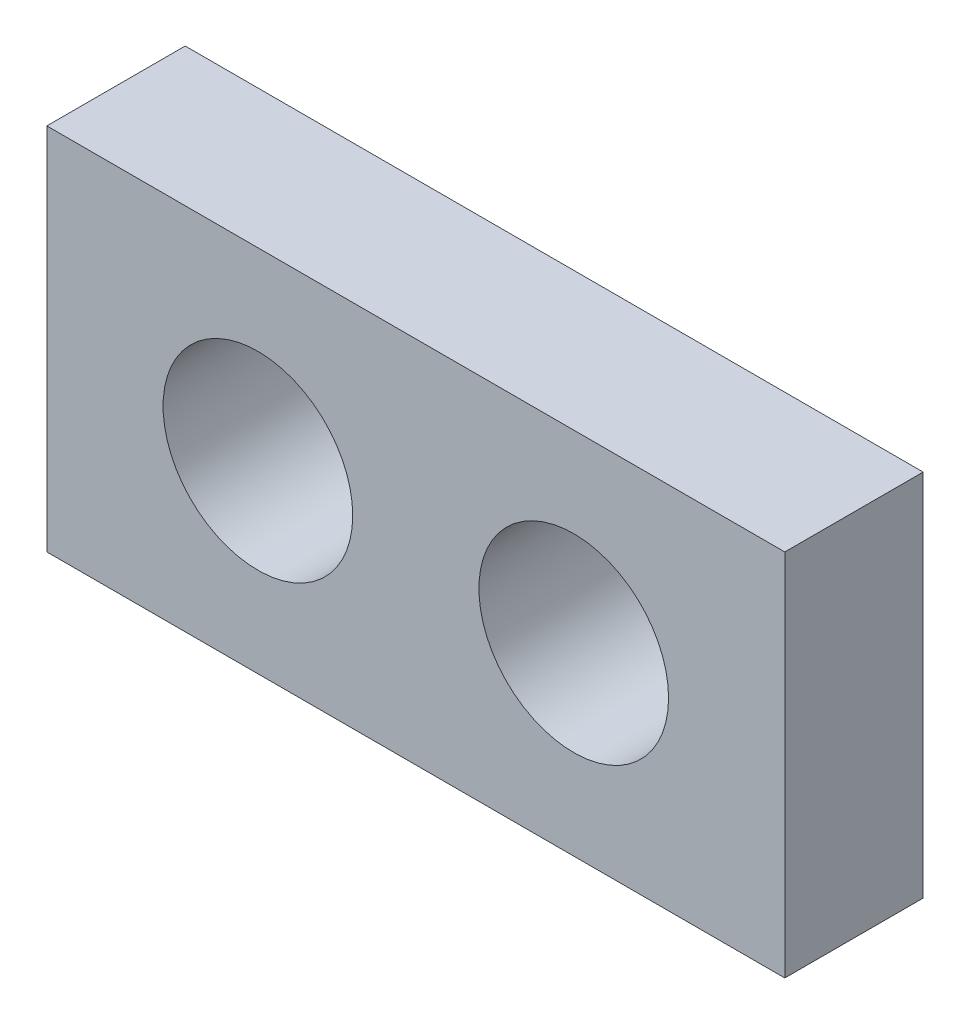
ISO-10303-21;
HEADER;
FILE_DESCRIPTION(('STEP AP214'),'2;1');
FILE_NAME('part.step','',(''),(''),'','','');
FILE_SCHEMA(('AUTOMOTIVE_DESIGN { 1 0 10303 214 1 1 1 1 }'));
ENDSEC;
DATA;
#1=APPLICATION_CONTEXT('core data for automotive mechanical design processes');
#2=APPLICATION_PROTOCOL_DEFINITION('international standard','automotive_design',2000,#1);
#3=PRODUCT_CONTEXT('',#1,'mechanical');
#4=PRODUCT('Part','Part','',(#3));
#5=PRODUCT_RELATED_PRODUCT_CATEGORY('part','',(#4));
#6=PRODUCT_DEFINITION_FORMATION('','',#4);
#7=PRODUCT_DEFINITION_CONTEXT('part definition',#1,'design');
#8=PRODUCT_DEFINITION('design','',#6,#7);
#9=PRODUCT_DEFINITION_SHAPE('','',#8);
#10=(LENGTH_UNIT() NAMED_UNIT(*) SI_UNIT(.MILLI.,.METRE.));
#11=(NAMED_UNIT(*) PLANE_ANGLE_UNIT() SI_UNIT($,.RADIAN.));
#12=(NAMED_UNIT(*) SI_UNIT($,.STERADIAN.) SOLID_ANGLE_UNIT());
#13=UNCERTAINTY_MEASURE_WITH_UNIT(LENGTH_MEASURE(1.E-05),#10,'distance_accuracy_value','');
#14=(GEOMETRIC_REPRESENTATION_CONTEXT(3) GLOBAL_UNCERTAINTY_ASSIGNED_CONTEXT((#13)) GLOBAL_UNIT_ASSIGNED_CONTEXT((#10,
#11,#12)) REPRESENTATION_CONTEXT('',''));
#15=CARTESIAN_POINT('',(0.,0.,0.));
#16=DIRECTION('',(0.,0.,1.));
#17=DIRECTION('',(1.,0.,0.));
#18=AXIS2_PLACEMENT_3D('',#15,#16,#17);
#19=CARTESIAN_POINT('',(-12.7,-6.35,4.7625));
#20=DIRECTION('',(1.,0.,0.));
#21=DIRECTION('',(0.,0.,-1.));
#22=AXIS2_PLACEMENT_3D('',#19,#20,#21);
#23=PLANE('',#22);
#24=DIRECTION('',(0.,-1.,0.));
#25=VECTOR('',#24,1.);
#26=CARTESIAN_POINT('',(-12.7,-6.35,0.));
#27=LINE('',#26,#25);
#28=CARTESIAN_POINT('',(-12.7,6.35,0.));
#29=VERTEX_POINT('',#28);
#30=CARTESIAN_POINT('',(-12.7,-6.35,0.));
#31=VERTEX_POINT('',#30);
#32=EDGE_CURVE('E103',#29,#31,#27,.T.);
#33=ORIENTED_EDGE('',*,*,#32,.T.);
#34=DIRECTION('',(0.,0.,-1.));
#35=VECTOR('',#34,1.);
#36=CARTESIAN_POINT('',(-12.7,-6.35,4.7625));
#37=LINE('',#36,#35);
#38=CARTESIAN_POINT('',(-12.7,-6.35,4.7625));
#39=VERTEX_POINT('',#38);
#40=EDGE_CURVE('E11',#39,#31,#37,.T.);
#41=ORIENTED_EDGE('',*,*,#40,.F.);
#42=DIRECTION('',(0.,-1.,0.));
#43=VECTOR('',#42,1.);
#44=CARTESIAN_POINT('',(-12.7,-6.35,4.7625));
#45=LINE('',#44,#43);
#46=CARTESIAN_POINT('',(-12.7,6.35,4.7625));
#47=VERTEX_POINT('',#46);
#48=EDGE_CURVE('E90',#47,#39,#45,.T.);
#49=ORIENTED_EDGE('',*,*,#48,.F.);
#50=DIRECTION('',(0.,0.,-1.));
#51=VECTOR('',#50,1.);
#52=CARTESIAN_POINT('',(-12.7,6.35,4.7625));
#53=LINE('',#52,#51);
#54=EDGE_CURVE('E99',#47,#29,#53,.T.);
#55=ORIENTED_EDGE('',*,*,#54,.T.);
#56=EDGE_LOOP('',(#33,#41,#49,#55));
#57=FACE_BOUND('',#56,.T.);
#58=ADVANCED_FACE('F37',(#57),#23,.F.);
#59=CARTESIAN_POINT('',(-12.7,-6.35,4.7625));
#60=DIRECTION('',(0.,1.,0.));
#61=DIRECTION('',(0.,0.,1.));
#62=AXIS2_PLACEMENT_3D('',#59,#60,#61);
#63=PLANE('',#62);
#64=DIRECTION('',(1.,0.,0.));
#65=VECTOR('',#64,1.);
#66=CARTESIAN_POINT('',(-12.7,-6.35,0.));
#67=LINE('',#66,#65);
#68=CARTESIAN_POINT('',(12.7,-6.35,0.));
#69=VERTEX_POINT('',#68);
#70=EDGE_CURVE('E94',#31,#69,#67,.T.);
#71=ORIENTED_EDGE('',*,*,#70,.T.);
#72=DIRECTION('',(0.,0.,-1.));
#73=VECTOR('',#72,1.);
#74=CARTESIAN_POINT('',(12.7,-6.35,4.7625));
#75=LINE('',#74,#73);
#76=CARTESIAN_POINT('',(12.7,-6.35,4.7625));
#77=VERTEX_POINT('',#76);
#78=EDGE_CURVE('E46',#77,#69,#75,.T.);
#79=ORIENTED_EDGE('',*,*,#78,.F.);
#80=DIRECTION('',(1.,0.,0.));
#81=VECTOR('',#80,1.);
#82=CARTESIAN_POINT('',(-12.7,-6.35,4.7625));
#83=LINE('',#82,#81);
#84=EDGE_CURVE('E85',#39,#77,#83,.T.);
#85=ORIENTED_EDGE('',*,*,#84,.F.);
#86=ORIENTED_EDGE('',*,*,#40,.T.);
#87=EDGE_LOOP('',(#71,#79,#85,#86));
#88=FACE_BOUND('',#87,.T.);
#89=ADVANCED_FACE('F93',(#88),#63,.F.);
#90=CARTESIAN_POINT('',(12.7,-6.35,4.7625));
#91=DIRECTION('',(-1.,0.,0.));
#92=DIRECTION('',(0.,-1.,0.));
#93=AXIS2_PLACEMENT_3D('',#90,#91,#92);
#94=PLANE('',#93);
#95=DIRECTION('',(0.,1.,0.));
#96=VECTOR('',#95,1.);
#97=CARTESIAN_POINT('',(12.7,-6.35,0.));
#98=LINE('',#97,#96);
#99=CARTESIAN_POINT('',(12.7,6.35,0.));
#100=VERTEX_POINT('',#99);
#101=EDGE_CURVE('E72',#69,#100,#98,.T.);
#102=ORIENTED_EDGE('',*,*,#101,.T.);
#103=DIRECTION('',(0.,0.,-1.));
#104=VECTOR('',#103,1.);
#105=CARTESIAN_POINT('',(12.7,6.35,4.7625));
#106=LINE('',#105,#104);
#107=CARTESIAN_POINT('',(12.7,6.35,4.7625));
#108=VERTEX_POINT('',#107);
#109=EDGE_CURVE('E95',#108,#100,#106,.T.);
#110=ORIENTED_EDGE('',*,*,#109,.F.);
#111=DIRECTION('',(0.,1.,0.));
#112=VECTOR('',#111,1.);
#113=CARTESIAN_POINT('',(12.7,-6.35,4.7625));
#114=LINE('',#113,#112);
#115=EDGE_CURVE('E88',#77,#108,#114,.T.);
#116=ORIENTED_EDGE('',*,*,#115,.F.);
#117=ORIENTED_EDGE('',*,*,#78,.T.);
#118=EDGE_LOOP('',(#102,#110,#116,#117));
#119=FACE_BOUND('',#118,.T.);
#120=ADVANCED_FACE('F97',(#119),#94,.F.);
#121=CARTESIAN_POINT('',(-12.7,6.35,4.7625));
#122=DIRECTION('',(0.,-1.,0.));
#123=DIRECTION('',(1.,0.,0.));
#124=AXIS2_PLACEMENT_3D('',#121,#122,#123);
#125=PLANE('',#124);
#126=DIRECTION('',(-1.,0.,0.));
#127=VECTOR('',#126,1.);
#128=CARTESIAN_POINT('',(-12.7,6.35,0.));
#129=LINE('',#128,#127);
#130=EDGE_CURVE('E78',#100,#29,#129,.T.);
#131=ORIENTED_EDGE('',*,*,#130,.T.);
#132=ORIENTED_EDGE('',*,*,#54,.F.);
#133=DIRECTION('',(-1.,0.,0.));
#134=VECTOR('',#133,1.);
#135=CARTESIAN_POINT('',(-12.7,6.35,4.7625));
#136=LINE('',#135,#134);
#137=EDGE_CURVE('E55',#108,#47,#136,.T.);
#138=ORIENTED_EDGE('',*,*,#137,.F.);
#139=ORIENTED_EDGE('',*,*,#109,.T.);
#140=EDGE_LOOP('',(#131,#132,#138,#139));
#141=FACE_BOUND('',#140,.T.);
#142=ADVANCED_FACE('F130',(#141),#125,.F.);
#143=CARTESIAN_POINT('',(-12.7,6.35,4.7625));
#144=DIRECTION('',(0.,0.,-1.));
#145=DIRECTION('',(-1.,0.,0.));
#146=AXIS2_PLACEMENT_3D('',#143,#144,#145);
#147=PLANE('',#146);
#148=CARTESIAN_POINT('',(-5.4356,0.,4.7625));
#149=DIRECTION('',(0.,0.,1.));
#150=DIRECTION('',(1.,0.,0.));
#151=AXIS2_PLACEMENT_3D('',#148,#149,#150);
#152=CIRCLE('',#151,3.2639);
#153=CARTESIAN_POINT('',(-2.1717,0.,4.7625));
#154=VERTEX_POINT('',#153);
#155=EDGE_CURVE('E120',#154,#154,#152,.T.);
#156=ORIENTED_EDGE('',*,*,#155,.F.);
#157=EDGE_LOOP('',(#156));
#158=FACE_BOUND('',#157,.T.);
#159=CARTESIAN_POINT('',(5.4356,0.,4.7625));
#160=DIRECTION('',(0.,0.,1.));
#161=DIRECTION('',(1.,0.,0.));
#162=AXIS2_PLACEMENT_3D('',#159,#160,#161);
#163=CIRCLE('',#162,3.2639);
#164=CARTESIAN_POINT('',(8.6995,0.,4.7625));
#165=VERTEX_POINT('',#164);
#166=EDGE_CURVE('E112',#165,#165,#163,.T.);
#167=ORIENTED_EDGE('',*,*,#166,.F.);
#168=EDGE_LOOP('',(#167));
#169=FACE_BOUND('',#168,.T.);
#170=ORIENTED_EDGE('',*,*,#48,.T.);
#171=ORIENTED_EDGE('',*,*,#84,.T.);
#172=ORIENTED_EDGE('',*,*,#115,.T.);
#173=ORIENTED_EDGE('',*,*,#137,.T.);
#174=EDGE_LOOP('',(#170,#171,#172,#173));
#175=FACE_BOUND('',#174,.T.);
#176=ADVANCED_FACE('F86',(#158,#169,#175),#147,.F.);
#177=CARTESIAN_POINT('',(-12.7,6.35,0.));
#178=DIRECTION('',(0.,0.,-1.));
#179=DIRECTION('',(-1.,0.,0.));
#180=AXIS2_PLACEMENT_3D('',#177,#178,#179);
#181=PLANE('',#180);
#182=CARTESIAN_POINT('',(-5.4356,0.,0.));
#183=DIRECTION('',(0.,0.,-1.));
#184=DIRECTION('',(-1.,0.,0.));
#185=AXIS2_PLACEMENT_3D('',#182,#183,#184);
#186=CIRCLE('',#185,3.2639);
#187=CARTESIAN_POINT('',(-8.6995,0.,0.));
#188=VERTEX_POINT('',#187);
#189=EDGE_CURVE('E40',#188,#188,#186,.T.);
#190=ORIENTED_EDGE('',*,*,#189,.F.);
#191=EDGE_LOOP('',(#190));
#192=FACE_BOUND('',#191,.T.);
#193=CARTESIAN_POINT('',(5.4356,0.,0.));
#194=DIRECTION('',(0.,0.,-1.));
#195=DIRECTION('',(-1.,0.,0.));
#196=AXIS2_PLACEMENT_3D('',#193,#194,#195);
#197=CIRCLE('',#196,3.2639);
#198=CARTESIAN_POINT('',(2.1717,0.,0.));
#199=VERTEX_POINT('',#198);
#200=EDGE_CURVE('E106',#199,#199,#197,.T.);
#201=ORIENTED_EDGE('',*,*,#200,.F.);
#202=EDGE_LOOP('',(#201));
#203=FACE_BOUND('',#202,.T.);
#204=ORIENTED_EDGE('',*,*,#32,.F.);
#205=ORIENTED_EDGE('',*,*,#130,.F.);
#206=ORIENTED_EDGE('',*,*,#101,.F.);
#207=ORIENTED_EDGE('',*,*,#70,.F.);
#208=EDGE_LOOP('',(#204,#205,#206,#207));
#209=FACE_BOUND('',#208,.T.);
#210=ADVANCED_FACE('F129',(#192,#203,#209),#181,.T.);
#211=CARTESIAN_POINT('',(5.4356,0.,4.7625));
#212=DIRECTION('',(0.,0.,1.));
#213=DIRECTION('',(1.,0.,0.));
#214=AXIS2_PLACEMENT_3D('',#211,#212,#213);
#215=CYLINDRICAL_SURFACE('',#214,3.2639);
#216=ORIENTED_EDGE('',*,*,#200,.T.);
#217=EDGE_LOOP('',(#216));
#218=FACE_BOUND('',#217,.T.);
#219=ORIENTED_EDGE('',*,*,#166,.T.);
#220=EDGE_LOOP('',(#219));
#221=FACE_BOUND('',#220,.T.);
#222=ADVANCED_FACE('F136',(#218,#221),#215,.F.);
#223=CARTESIAN_POINT('',(-5.4356,0.,4.7625));
#224=DIRECTION('',(0.,0.,1.));
#225=DIRECTION('',(1.,0.,0.));
#226=AXIS2_PLACEMENT_3D('',#223,#224,#225);
#227=CYLINDRICAL_SURFACE('',#226,3.2639);
#228=ORIENTED_EDGE('',*,*,#189,.T.);
#229=EDGE_LOOP('',(#228));
#230=FACE_BOUND('',#229,.T.);
#231=ORIENTED_EDGE('',*,*,#155,.T.);
#232=EDGE_LOOP('',(#231));
#233=FACE_BOUND('',#232,.T.);
#234=ADVANCED_FACE('F125',(#230,#233),#227,.F.);
#235=CLOSED_SHELL('',(#58,#89,#120,#142,#176,#210,#222,#234));
#236=MANIFOLD_SOLID_BREP('B2',#235);
#237=ADVANCED_BREP_SHAPE_REPRESENTATION('',(#18,#236),#14);
#238=SHAPE_DEFINITION_REPRESENTATION(#9,#237);
ENDSEC;
END-ISO-10303-21;
